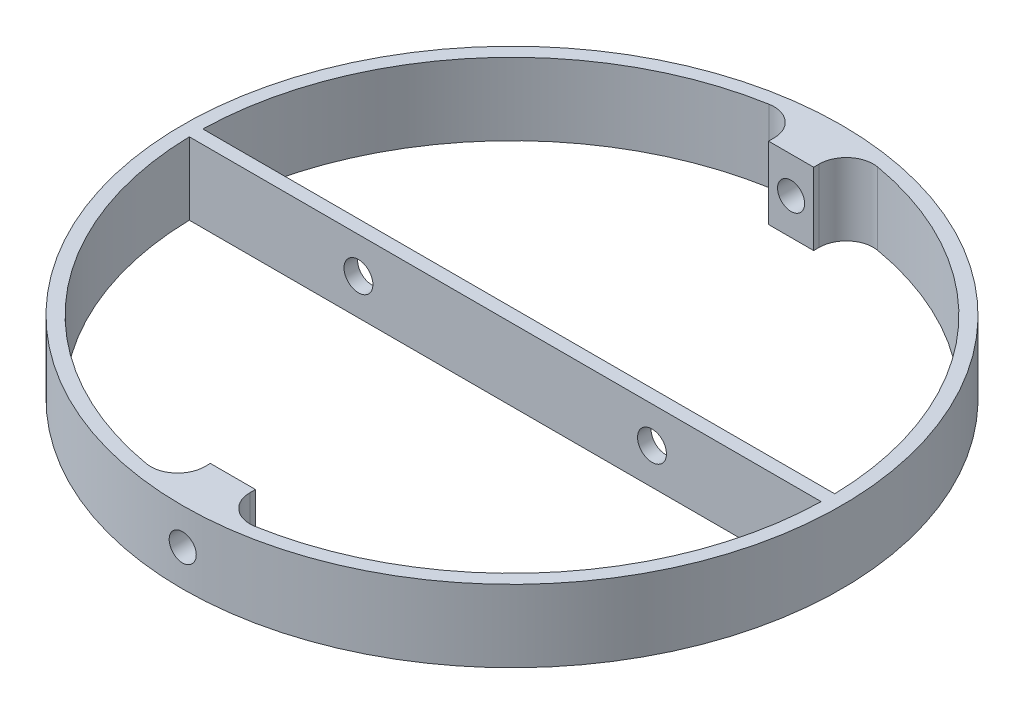
ISO-10303-21;
HEADER;
FILE_DESCRIPTION(('STEP AP214'),'2;1');
FILE_NAME('part.step','',(''),(''),'','','');
FILE_SCHEMA(('AUTOMOTIVE_DESIGN { 1 0 10303 214 1 1 1 1 }'));
ENDSEC;
DATA;
#1=APPLICATION_CONTEXT('core data for automotive mechanical design processes');
#2=APPLICATION_PROTOCOL_DEFINITION('international standard','automotive_design',2000,#1);
#3=PRODUCT_CONTEXT('',#1,'mechanical');
#4=PRODUCT('Part','Part','',(#3));
#5=PRODUCT_RELATED_PRODUCT_CATEGORY('part','',(#4));
#6=PRODUCT_DEFINITION_FORMATION('','',#4);
#7=PRODUCT_DEFINITION_CONTEXT('part definition',#1,'design');
#8=PRODUCT_DEFINITION('design','',#6,#7);
#9=PRODUCT_DEFINITION_SHAPE('','',#8);
#10=(LENGTH_UNIT() NAMED_UNIT(*) SI_UNIT(.MILLI.,.METRE.));
#11=(NAMED_UNIT(*) PLANE_ANGLE_UNIT() SI_UNIT($,.RADIAN.));
#12=(NAMED_UNIT(*) SI_UNIT($,.STERADIAN.) SOLID_ANGLE_UNIT());
#13=UNCERTAINTY_MEASURE_WITH_UNIT(LENGTH_MEASURE(1.E-05),#10,'distance_accuracy_value','');
#14=(GEOMETRIC_REPRESENTATION_CONTEXT(3) GLOBAL_UNCERTAINTY_ASSIGNED_CONTEXT((#13)) GLOBAL_UNIT_ASSIGNED_CONTEXT((#10,
#11,#12)) REPRESENTATION_CONTEXT('',''));
#15=CARTESIAN_POINT('',(0.,0.,0.));
#16=DIRECTION('',(0.,0.,1.));
#17=DIRECTION('',(1.,0.,0.));
#18=AXIS2_PLACEMENT_3D('',#15,#16,#17);
#19=CARTESIAN_POINT('',(0.,4.,0.));
#20=DIRECTION('',(0.,-1.,0.));
#21=DIRECTION('',(0.,0.,-1.));
#22=AXIS2_PLACEMENT_3D('',#19,#20,#21);
#23=CYLINDRICAL_SURFACE('',#22,36.5);
#24=CARTESIAN_POINT('',(0.,-4.,0.));
#25=DIRECTION('',(0.,1.,0.));
#26=DIRECTION('',(0.,0.,1.));
#27=AXIS2_PLACEMENT_3D('',#24,#25,#26);
#28=CIRCLE('',#27,36.5);
#29=CARTESIAN_POINT('',(0.,-4.,36.5));
#30=VERTEX_POINT('',#29);
#31=EDGE_CURVE('E174',#30,#30,#28,.T.);
#32=ORIENTED_EDGE('',*,*,#31,.T.);
#33=EDGE_LOOP('',(#32));
#34=FACE_BOUND('',#33,.T.);
#35=CARTESIAN_POINT('',(0.,4.,0.));
#36=DIRECTION('',(0.,1.,0.));
#37=DIRECTION('',(0.,0.,1.));
#38=AXIS2_PLACEMENT_3D('',#35,#36,#37);
#39=CIRCLE('',#38,36.5);
#40=CARTESIAN_POINT('',(0.,4.,36.5));
#41=VERTEX_POINT('',#40);
#42=EDGE_CURVE('E184',#41,#41,#39,.T.);
#43=ORIENTED_EDGE('',*,*,#42,.F.);
#44=EDGE_LOOP('',(#43));
#45=FACE_BOUND('',#44,.T.);
#46=CARTESIAN_POINT('',(1.5,0.,36.4691650576209));
#47=CARTESIAN_POINT('',(1.49999627712977,0.0842174806806867,36.4691654727784));
#48=CARTESIAN_POINT('',(1.49288360164586,0.168495121456788,36.4694599147074));
#49=CARTESIAN_POINT('',(1.46460989667378,0.334726733648258,36.4706061138936));
#50=CARTESIAN_POINT('',(1.44343219891228,0.416677827602146,36.4714585323841));
#51=CARTESIAN_POINT('',(1.38763469747089,0.575824179001918,36.4736239628223));
#52=CARTESIAN_POINT('',(1.35302160607741,0.653021788996812,36.4749367447421));
#53=CARTESIAN_POINT('',(1.27134582264112,0.800489682891105,36.4778746856881));
#54=CARTESIAN_POINT('',(1.22428612014412,0.8707616247076,36.479499769677));
#55=CARTESIAN_POINT('',(1.11901404288202,1.00245602102927,36.4828805666072));
#56=CARTESIAN_POINT('',(1.06079463482925,1.06387285169303,36.4846363614985));
#57=CARTESIAN_POINT('',(0.934869277519661,1.17606588607866,36.488079947785));
#58=CARTESIAN_POINT('',(0.867162946031318,1.22684166086279,36.4897677364367));
#59=CARTESIAN_POINT('',(0.724158987498465,1.31632457527012,36.4928856443443));
#60=CARTESIAN_POINT('',(0.648858820990925,1.35502765982304,36.4943156769552));
#61=CARTESIAN_POINT('',(0.492822636830936,1.41924043264145,36.4967561294673));
#62=CARTESIAN_POINT('',(0.412086650504941,1.44475019693228,36.4977665517865));
#63=CARTESIAN_POINT('',(0.247519393292795,1.4818382383119,36.499253386519));
#64=CARTESIAN_POINT('',(0.163689913435263,1.49342445017704,36.4997301030708));
#65=CARTESIAN_POINT('',(-0.00472539112217277,1.5023609694828,36.5000968164548));
#66=CARTESIAN_POINT('',(-0.089311211354027,1.49971136096556,36.4999868167507));
#67=CARTESIAN_POINT('',(-0.25678438616484,1.48025807510265,36.4991927528678));
#68=CARTESIAN_POINT('',(-0.339672735545438,1.46346294588897,36.4985090353872));
#69=CARTESIAN_POINT('',(-0.501452537562888,1.41620861089294,36.4966449700384));
#70=CARTESIAN_POINT('',(-0.580343977463555,1.3857493615728,36.4954646205878));
#71=CARTESIAN_POINT('',(-0.731918063482316,1.31202163252047,36.4927396890167));
#72=CARTESIAN_POINT('',(-0.804598807371535,1.26874924633724,36.4911949958449));
#73=CARTESIAN_POINT('',(-0.941667545936242,1.17062645726109,36.4879153976571));
#74=CARTESIAN_POINT('',(-1.00605550211961,1.11577600063007,36.4861804917582));
#75=CARTESIAN_POINT('',(-1.12476076523942,0.996005720707265,36.4827144022264));
#76=CARTESIAN_POINT('',(-1.17907059045482,0.931078481836806,36.4809832222943));
#77=CARTESIAN_POINT('',(-1.27602032028627,0.793023783110528,36.4777210468136));
#78=CARTESIAN_POINT('',(-1.31866022247567,0.719896321549557,36.4761900513066));
#79=CARTESIAN_POINT('',(-1.39105898510128,0.567512632935963,36.4735009817359));
#80=CARTESIAN_POINT('',(-1.4208175837822,0.488256281379437,36.4723429152505));
#81=CARTESIAN_POINT('',(-1.46660409784318,0.325866579422571,36.4705305957564));
#82=CARTESIAN_POINT('',(-1.48263208305901,0.242733248743341,36.4698763401853));
#83=CARTESIAN_POINT('',(-1.50049317862057,0.0750145709202017,36.4691458884583));
#84=CARTESIAN_POINT('',(-1.50233666386563,-0.00956966959801294,36.4690692698051));
#85=CARTESIAN_POINT('',(-1.49180348510873,-0.177846360399193,36.4695016291334));
#86=CARTESIAN_POINT('',(-1.4794268526285,-0.261538812658569,36.4700106058167));
#87=CARTESIAN_POINT('',(-1.44081336398823,-0.425627162955387,36.4715563987382));
#88=CARTESIAN_POINT('',(-1.4145812394599,-0.506024176286727,36.472593034777));
#89=CARTESIAN_POINT('',(-1.34900619156947,-0.661273776704302,36.4750771440585));
#90=CARTESIAN_POINT('',(-1.30966321735534,-0.736126342284351,36.4765246188946));
#91=CARTESIAN_POINT('',(-1.21895658567319,-0.878210021097048,36.4796682771395));
#92=CARTESIAN_POINT('',(-1.16758594944701,-0.945436675834785,36.4813646047247));
#93=CARTESIAN_POINT('',(-1.05429243826421,-1.07031539974948,36.4848142484667));
#94=CARTESIAN_POINT('',(-0.992369516427886,-1.12796742638784,36.4865675648766));
#95=CARTESIAN_POINT('',(-0.859684698074924,-1.23209511282749,36.4899347847021));
#96=CARTESIAN_POINT('',(-0.788917544915198,-1.27856407742287,36.4915486042335));
#97=CARTESIAN_POINT('',(-0.640579758797549,-1.35896079614293,36.4944537349901));
#98=CARTESIAN_POINT('',(-0.563009148239972,-1.39288859155742,36.4957450472772));
#99=CARTESIAN_POINT('',(-0.403291468674011,-1.44722815225677,36.4978592144783));
#100=CARTESIAN_POINT('',(-0.321145868149088,-1.46764422774339,36.4986822187695));
#101=CARTESIAN_POINT('',(-0.154589356719907,-1.49439493401989,36.4997676003611));
#102=CARTESIAN_POINT('',(-0.0701784531214033,-1.50072961021771,36.5000299794693));
#103=CARTESIAN_POINT('',(0.0984459266947519,-1.49913721244927,36.4999645476086));
#104=CARTESIAN_POINT('',(0.182659502632082,-1.49122065867127,36.4996371719935));
#105=CARTESIAN_POINT('',(0.348561042887096,-1.46137222420615,36.4984299581184));
#106=CARTESIAN_POINT('',(0.430249002308517,-1.43944031635007,36.4975501187874));
#107=CARTESIAN_POINT('',(0.58878327300713,-1.38218567266201,36.4953370225089));
#108=CARTESIAN_POINT('',(0.665629521162431,-1.34686276229225,36.4940037596516));
#109=CARTESIAN_POINT('',(0.812300607120264,-1.26383111787181,36.4910339024558));
#110=CARTESIAN_POINT('',(0.882125679764774,-1.21612279827556,36.489397318268));
#111=CARTESIAN_POINT('',(1.01282375571061,-1.10963872008058,36.4860037881951));
#112=CARTESIAN_POINT('',(1.07369108667315,-1.05085600205999,36.4842467670688));
#113=CARTESIAN_POINT('',(1.18471121576859,-0.923889308150094,36.4808107539502));
#114=CARTESIAN_POINT('',(1.23486136556362,-0.855703015363332,36.4791317813247));
#115=CARTESIAN_POINT('',(1.32303942260111,-0.711824836857678,36.4760403695905));
#116=CARTESIAN_POINT('',(1.36105759015399,-0.636126984363831,36.4746281449993));
#117=CARTESIAN_POINT('',(1.42380028872462,-0.479474477982601,36.4722331077676));
#118=CARTESIAN_POINT('',(1.44854059808691,-0.39852619213693,36.4712497857151));
#119=CARTESIAN_POINT('',(1.47750183703643,-0.264225554415599,36.4700850646762));
#120=CARTESIAN_POINT('',(1.48592795587244,-0.21174404656794,36.4697415720497));
#121=CARTESIAN_POINT('',(1.49717820949968,-0.106182998709553,36.4692814376972));
#122=CARTESIAN_POINT('',(1.50000234746142,-0.0531034590373052,36.4691647958428));
#123=CARTESIAN_POINT('',(1.5,0.,36.4691650576209));
#124=B_SPLINE_CURVE_WITH_KNOTS('',3,(#46,#47,#48,#49,#50,#51,#52,#53,#54,#55,#56,#57,#58,#59,
#60,#61,#62,#63,#64,#65,#66,#67,#68,#69,#70,#71,#72,#73,#74,#75,#76,#77,#78,#79,#80,#81,#82,#83,
#84,#85,#86,#87,#88,#89,#90,#91,#92,#93,#94,#95,#96,#97,#98,#99,#100,#101,#102,#103,#104,#105,
#106,#107,#108,#109,#110,#111,#112,#113,#114,#115,#116,#117,#118,#119,#120,#121,#122,#123),
.UNSPECIFIED.,.T.,.F.,(4,2,2,2,2,2,2,2,2,2,2,2,2,2,2,2,2,2,2,2,2,2,2,2,2,2,2,2,2,2,2,2,2,2,2,2,
2,2,4),(0.,0.25245860089904,0.505216922310907,0.757849128541452,1.01042071017696,
1.26315199891647,1.51589347321891,1.76871974913256,2.02154456814122,2.27422523850833,
2.52690441715964,2.77943101135911,3.03195841018608,3.28456287861991,3.53716851950998,
3.7899609440007,4.04275342105714,4.29555103475693,4.54834736268601,4.80095877144243,
5.05356962023648,5.30609425849095,5.55861987620404,5.81129238046393,6.0639660072786,
6.31679053343784,6.56961422720493,6.82235723198084,7.07509942174153,7.32765511495538,
7.58021129775345,7.83277077247165,8.08532179685137,8.33803206307437,8.59080470486408,
8.84377976776059,9.09645354595142,9.25564178633398,9.41482993662179),.UNSPECIFIED.);
#125=CARTESIAN_POINT('',(1.5,0.,36.4691650576209));
#126=VERTEX_POINT('',#125);
#127=EDGE_CURVE('E527',#126,#126,#124,.T.);
#128=ORIENTED_EDGE('',*,*,#127,.F.);
#129=EDGE_LOOP('',(#128));
#130=FACE_BOUND('',#129,.T.);
#131=CARTESIAN_POINT('',(-1.5,0.,-36.4691650576209));
#132=CARTESIAN_POINT('',(-1.49999627712977,-0.0842174806806867,-36.4691654727784));
#133=CARTESIAN_POINT('',(-1.49288360164586,-0.168495121456788,-36.4694599147074));
#134=CARTESIAN_POINT('',(-1.46460989667378,-0.334726733648258,-36.4706061138936));
#135=CARTESIAN_POINT('',(-1.44343219891228,-0.416677827602146,-36.4714585323841));
#136=CARTESIAN_POINT('',(-1.38763469747089,-0.575824179001918,-36.4736239628223));
#137=CARTESIAN_POINT('',(-1.35302160607741,-0.653021788996812,-36.4749367447421));
#138=CARTESIAN_POINT('',(-1.27134582264112,-0.800489682891105,-36.4778746856881));
#139=CARTESIAN_POINT('',(-1.22428612014412,-0.8707616247076,-36.479499769677));
#140=CARTESIAN_POINT('',(-1.11901404288202,-1.00245602102927,-36.4828805666072));
#141=CARTESIAN_POINT('',(-1.06079463482925,-1.06387285169303,-36.4846363614985));
#142=CARTESIAN_POINT('',(-0.934869277519661,-1.17606588607866,-36.488079947785));
#143=CARTESIAN_POINT('',(-0.867162946031318,-1.22684166086279,-36.4897677364367));
#144=CARTESIAN_POINT('',(-0.724158987498465,-1.31632457527012,-36.4928856443443));
#145=CARTESIAN_POINT('',(-0.648858820990925,-1.35502765982304,-36.4943156769552));
#146=CARTESIAN_POINT('',(-0.492822636830936,-1.41924043264145,-36.4967561294673));
#147=CARTESIAN_POINT('',(-0.412086650504941,-1.44475019693228,-36.4977665517865));
#148=CARTESIAN_POINT('',(-0.247519393292795,-1.4818382383119,-36.499253386519));
#149=CARTESIAN_POINT('',(-0.163689913435263,-1.49342445017704,-36.4997301030708));
#150=CARTESIAN_POINT('',(0.00472539112217277,-1.5023609694828,-36.5000968164548));
#151=CARTESIAN_POINT('',(0.089311211354027,-1.49971136096556,-36.4999868167507));
#152=CARTESIAN_POINT('',(0.25678438616484,-1.48025807510265,-36.4991927528678));
#153=CARTESIAN_POINT('',(0.339672735545438,-1.46346294588897,-36.4985090353872));
#154=CARTESIAN_POINT('',(0.501452537562888,-1.41620861089294,-36.4966449700384));
#155=CARTESIAN_POINT('',(0.580343977463555,-1.3857493615728,-36.4954646205878));
#156=CARTESIAN_POINT('',(0.731918063482316,-1.31202163252047,-36.4927396890167));
#157=CARTESIAN_POINT('',(0.804598807371535,-1.26874924633724,-36.4911949958449));
#158=CARTESIAN_POINT('',(0.941667545936242,-1.17062645726109,-36.4879153976571));
#159=CARTESIAN_POINT('',(1.00605550211961,-1.11577600063007,-36.4861804917582));
#160=CARTESIAN_POINT('',(1.12476076523942,-0.996005720707265,-36.4827144022264));
#161=CARTESIAN_POINT('',(1.17907059045482,-0.931078481836806,-36.4809832222943));
#162=CARTESIAN_POINT('',(1.27602032028627,-0.793023783110528,-36.4777210468136));
#163=CARTESIAN_POINT('',(1.31866022247567,-0.719896321549557,-36.4761900513066));
#164=CARTESIAN_POINT('',(1.39105898510128,-0.567512632935963,-36.4735009817359));
#165=CARTESIAN_POINT('',(1.4208175837822,-0.488256281379437,-36.4723429152505));
#166=CARTESIAN_POINT('',(1.46660409784318,-0.325866579422571,-36.4705305957564));
#167=CARTESIAN_POINT('',(1.48263208305901,-0.242733248743341,-36.4698763401853));
#168=CARTESIAN_POINT('',(1.50049317862057,-0.0750145709202017,-36.4691458884583));
#169=CARTESIAN_POINT('',(1.50233666386563,0.00956966959801294,-36.4690692698051));
#170=CARTESIAN_POINT('',(1.49180348510873,0.177846360399193,-36.4695016291334));
#171=CARTESIAN_POINT('',(1.4794268526285,0.261538812658569,-36.4700106058167));
#172=CARTESIAN_POINT('',(1.44081336398823,0.425627162955387,-36.4715563987382));
#173=CARTESIAN_POINT('',(1.4145812394599,0.506024176286727,-36.472593034777));
#174=CARTESIAN_POINT('',(1.34900619156947,0.661273776704302,-36.4750771440585));
#175=CARTESIAN_POINT('',(1.30966321735534,0.736126342284351,-36.4765246188946));
#176=CARTESIAN_POINT('',(1.21895658567319,0.878210021097048,-36.4796682771395));
#177=CARTESIAN_POINT('',(1.16758594944701,0.945436675834785,-36.4813646047247));
#178=CARTESIAN_POINT('',(1.05429243826421,1.07031539974948,-36.4848142484667));
#179=CARTESIAN_POINT('',(0.992369516427886,1.12796742638784,-36.4865675648766));
#180=CARTESIAN_POINT('',(0.859684698074924,1.23209511282749,-36.4899347847021));
#181=CARTESIAN_POINT('',(0.788917544915198,1.27856407742287,-36.4915486042335));
#182=CARTESIAN_POINT('',(0.640579758797549,1.35896079614293,-36.4944537349901));
#183=CARTESIAN_POINT('',(0.563009148239972,1.39288859155742,-36.4957450472772));
#184=CARTESIAN_POINT('',(0.403291468674011,1.44722815225677,-36.4978592144783));
#185=CARTESIAN_POINT('',(0.321145868149088,1.46764422774339,-36.4986822187695));
#186=CARTESIAN_POINT('',(0.154589356719907,1.49439493401989,-36.4997676003611));
#187=CARTESIAN_POINT('',(0.0701784531214033,1.50072961021771,-36.5000299794693));
#188=CARTESIAN_POINT('',(-0.0984459266947519,1.49913721244927,-36.4999645476086));
#189=CARTESIAN_POINT('',(-0.182659502632082,1.49122065867127,-36.4996371719935));
#190=CARTESIAN_POINT('',(-0.348561042887096,1.46137222420615,-36.4984299581184));
#191=CARTESIAN_POINT('',(-0.430249002308517,1.43944031635007,-36.4975501187874));
#192=CARTESIAN_POINT('',(-0.58878327300713,1.38218567266201,-36.4953370225089));
#193=CARTESIAN_POINT('',(-0.665629521162431,1.34686276229225,-36.4940037596516));
#194=CARTESIAN_POINT('',(-0.812300607120264,1.26383111787181,-36.4910339024558));
#195=CARTESIAN_POINT('',(-0.882125679764774,1.21612279827556,-36.489397318268));
#196=CARTESIAN_POINT('',(-1.01282375571061,1.10963872008058,-36.4860037881951));
#197=CARTESIAN_POINT('',(-1.07369108667315,1.05085600205999,-36.4842467670688));
#198=CARTESIAN_POINT('',(-1.18471121576859,0.923889308150094,-36.4808107539502));
#199=CARTESIAN_POINT('',(-1.23486136556362,0.855703015363332,-36.4791317813247));
#200=CARTESIAN_POINT('',(-1.32303942260111,0.711824836857678,-36.4760403695905));
#201=CARTESIAN_POINT('',(-1.36105759015399,0.636126984363831,-36.4746281449993));
#202=CARTESIAN_POINT('',(-1.42380028872462,0.479474477982601,-36.4722331077676));
#203=CARTESIAN_POINT('',(-1.44854059808691,0.39852619213693,-36.4712497857151));
#204=CARTESIAN_POINT('',(-1.47750183703643,0.264225554415599,-36.4700850646762));
#205=CARTESIAN_POINT('',(-1.48592795587244,0.21174404656794,-36.4697415720497));
#206=CARTESIAN_POINT('',(-1.49717820949968,0.106182998709553,-36.4692814376972));
#207=CARTESIAN_POINT('',(-1.50000234746142,0.0531034590373052,-36.4691647958428));
#208=CARTESIAN_POINT('',(-1.5,0.,-36.4691650576209));
#209=B_SPLINE_CURVE_WITH_KNOTS('',3,(#131,#132,#133,#134,#135,#136,#137,#138,#139,#140,#141,
#142,#143,#144,#145,#146,#147,#148,#149,#150,#151,#152,#153,#154,#155,#156,#157,#158,#159,#160,
#161,#162,#163,#164,#165,#166,#167,#168,#169,#170,#171,#172,#173,#174,#175,#176,#177,#178,#179,
#180,#181,#182,#183,#184,#185,#186,#187,#188,#189,#190,#191,#192,#193,#194,#195,#196,#197,#198,
#199,#200,#201,#202,#203,#204,#205,#206,#207,#208),.UNSPECIFIED.,.T.,.F.,(4,2,2,2,2,2,2,2,2,2,2,
2,2,2,2,2,2,2,2,2,2,2,2,2,2,2,2,2,2,2,2,2,2,2,2,2,2,2,4),(0.,0.25245860089904,0.505216922310907,
0.757849128541452,1.01042071017696,1.26315199891647,1.51589347321891,1.76871974913256,
2.02154456814122,2.27422523850833,2.52690441715964,2.77943101135911,3.03195841018608,
3.28456287861991,3.53716851950998,3.7899609440007,4.04275342105714,4.29555103475693,
4.54834736268601,4.80095877144243,5.05356962023648,5.30609425849095,5.55861987620404,
5.81129238046393,6.0639660072786,6.31679053343784,6.56961422720493,6.82235723198084,
7.07509942174153,7.32765511495538,7.58021129775345,7.83277077247165,8.08532179685137,
8.33803206307437,8.59080470486408,8.84377976776059,9.09645354595142,9.25564178633398,
9.41482993662179),.UNSPECIFIED.);
#210=CARTESIAN_POINT('',(-1.5,0.,-36.4691650576209));
#211=VERTEX_POINT('',#210);
#212=EDGE_CURVE('E537',#211,#211,#209,.T.);
#213=ORIENTED_EDGE('',*,*,#212,.T.);
#214=EDGE_LOOP('',(#213));
#215=FACE_BOUND('',#214,.T.);
#216=ADVANCED_FACE('F35',(#34,#45,#130,#215),#23,.T.);
#217=CARTESIAN_POINT('',(0.,4.,-0.75));
#218=DIRECTION('',(0.,0.,-1.));
#219=DIRECTION('',(-1.,0.,0.));
#220=AXIS2_PLACEMENT_3D('',#217,#218,#219);
#221=PLANE('',#220);
#222=CARTESIAN_POINT('',(16.256,0.,-0.750000000000001));
#223=DIRECTION('',(0.,0.,-1.));
#224=DIRECTION('',(-1.,0.,0.));
#225=AXIS2_PLACEMENT_3D('',#222,#223,#224);
#226=CIRCLE('',#225,1.6);
#227=CARTESIAN_POINT('',(14.656,0.,-0.750000000000001));
#228=VERTEX_POINT('',#227);
#229=EDGE_CURVE('E554',#228,#228,#226,.F.);
#230=ORIENTED_EDGE('',*,*,#229,.T.);
#231=EDGE_LOOP('',(#230));
#232=FACE_BOUND('',#231,.T.);
#233=CARTESIAN_POINT('',(-16.256,0.,-0.750000000000001));
#234=DIRECTION('',(0.,0.,-1.));
#235=DIRECTION('',(-1.,0.,0.));
#236=AXIS2_PLACEMENT_3D('',#233,#234,#235);
#237=CIRCLE('',#236,1.6);
#238=CARTESIAN_POINT('',(-17.856,0.,-0.750000000000001));
#239=VERTEX_POINT('',#238);
#240=EDGE_CURVE('E548',#239,#239,#237,.F.);
#241=ORIENTED_EDGE('',*,*,#240,.T.);
#242=EDGE_LOOP('',(#241));
#243=FACE_BOUND('',#242,.T.);
#244=DIRECTION('',(1.,0.,0.));
#245=VECTOR('',#244,1.);
#246=CARTESIAN_POINT('',(0.,-4.,-0.75));
#247=LINE('',#246,#245);
#248=CARTESIAN_POINT('',(-34.9919633630352,-4.,-0.75));
#249=VERTEX_POINT('',#248);
#250=CARTESIAN_POINT('',(34.9919633630352,-4.,-0.75));
#251=VERTEX_POINT('',#250);
#252=EDGE_CURVE('E226',#249,#251,#247,.T.);
#253=ORIENTED_EDGE('',*,*,#252,.F.);
#254=DIRECTION('',(0.,-1.,0.));
#255=VECTOR('',#254,1.);
#256=CARTESIAN_POINT('',(-34.9919633630352,4.,-0.75));
#257=LINE('',#256,#255);
#258=CARTESIAN_POINT('',(-34.9919633630352,4.,-0.75));
#259=VERTEX_POINT('',#258);
#260=EDGE_CURVE('E244',#259,#249,#257,.T.);
#261=ORIENTED_EDGE('',*,*,#260,.F.);
#262=DIRECTION('',(1.,0.,0.));
#263=VECTOR('',#262,1.);
#264=CARTESIAN_POINT('',(0.,4.,-0.75));
#265=LINE('',#264,#263);
#266=CARTESIAN_POINT('',(34.9919633630352,4.,-0.75));
#267=VERTEX_POINT('',#266);
#268=EDGE_CURVE('E196',#259,#267,#265,.T.);
#269=ORIENTED_EDGE('',*,*,#268,.T.);
#270=DIRECTION('',(0.,-1.,0.));
#271=VECTOR('',#270,1.);
#272=CARTESIAN_POINT('',(34.9919633630352,4.,-0.75));
#273=LINE('',#272,#271);
#274=EDGE_CURVE('E158',#267,#251,#273,.T.);
#275=ORIENTED_EDGE('',*,*,#274,.T.);
#276=EDGE_LOOP('',(#253,#261,#269,#275));
#277=FACE_BOUND('',#276,.T.);
#278=ADVANCED_FACE('F301',(#232,#243,#277),#221,.T.);
#279=CARTESIAN_POINT('',(0.,4.,0.));
#280=DIRECTION('',(0.,-1.,0.));
#281=DIRECTION('',(0.,0.,-1.));
#282=AXIS2_PLACEMENT_3D('',#279,#280,#281);
#283=CYLINDRICAL_SURFACE('',#282,35.);
#284=CARTESIAN_POINT('',(0.,-4.,0.));
#285=DIRECTION('',(0.,1.,0.));
#286=DIRECTION('',(0.,0.,1.));
#287=AXIS2_PLACEMENT_3D('',#284,#285,#286);
#288=CIRCLE('',#287,35.);
#289=CARTESIAN_POINT('',(-6.015625,-4.,-34.479156832199));
#290=VERTEX_POINT('',#289);
#291=EDGE_CURVE('E229',#290,#249,#288,.T.);
#292=ORIENTED_EDGE('',*,*,#291,.F.);
#293=DIRECTION('',(0.,-1.,0.));
#294=VECTOR('',#293,1.);
#295=CARTESIAN_POINT('',(-6.015625,4.,-34.479156832199));
#296=LINE('',#295,#294);
#297=CARTESIAN_POINT('',(-6.015625,4.,-34.479156832199));
#298=VERTEX_POINT('',#297);
#299=EDGE_CURVE('E259',#290,#298,#296,.F.);
#300=ORIENTED_EDGE('',*,*,#299,.T.);
#301=CARTESIAN_POINT('',(0.,4.,0.));
#302=DIRECTION('',(0.,1.,0.));
#303=DIRECTION('',(0.,0.,1.));
#304=AXIS2_PLACEMENT_3D('',#301,#302,#303);
#305=CIRCLE('',#304,35.);
#306=EDGE_CURVE('E182',#298,#259,#305,.T.);
#307=ORIENTED_EDGE('',*,*,#306,.T.);
#308=ORIENTED_EDGE('',*,*,#260,.T.);
#309=EDGE_LOOP('',(#292,#300,#307,#308));
#310=FACE_BOUND('',#309,.T.);
#311=ADVANCED_FACE('F307',(#310),#283,.F.);
#312=CARTESIAN_POINT('',(-2.50000000000001,4.,0.));
#313=DIRECTION('',(-1.,0.,0.));
#314=DIRECTION('',(0.,0.,1.));
#315=AXIS2_PLACEMENT_3D('',#312,#313,#314);
#316=PLANE('',#315);
#317=DIRECTION('',(0.,0.,-1.));
#318=VECTOR('',#317,1.);
#319=CARTESIAN_POINT('',(-2.50000000000001,4.,0.));
#320=LINE('',#319,#318);
#321=CARTESIAN_POINT('',(-2.5,4.,-30.9106001094224));
#322=VERTEX_POINT('',#321);
#323=CARTESIAN_POINT('',(-2.5,4.,-31.5238005322962));
#324=VERTEX_POINT('',#323);
#325=EDGE_CURVE('E195',#322,#324,#320,.T.);
#326=ORIENTED_EDGE('',*,*,#325,.T.);
#327=DIRECTION('',(0.,1.,0.));
#328=VECTOR('',#327,1.);
#329=CARTESIAN_POINT('',(-2.5,-4.,-31.5238005322962));
#330=LINE('',#329,#328);
#331=CARTESIAN_POINT('',(-2.5,-4.,-31.5238005322962));
#332=VERTEX_POINT('',#331);
#333=EDGE_CURVE('E256',#324,#332,#330,.F.);
#334=ORIENTED_EDGE('',*,*,#333,.T.);
#335=DIRECTION('',(0.,0.,-1.));
#336=VECTOR('',#335,1.);
#337=CARTESIAN_POINT('',(-2.50000000000001,-4.,0.));
#338=LINE('',#337,#336);
#339=CARTESIAN_POINT('',(-2.5,-4.,-30.9106001094224));
#340=VERTEX_POINT('',#339);
#341=EDGE_CURVE('E230',#340,#332,#338,.T.);
#342=ORIENTED_EDGE('',*,*,#341,.F.);
#343=DIRECTION('',(0.,-1.,0.));
#344=VECTOR('',#343,1.);
#345=CARTESIAN_POINT('',(-2.5,4.,-30.9106001094224));
#346=LINE('',#345,#344);
#347=EDGE_CURVE('E242',#322,#340,#346,.T.);
#348=ORIENTED_EDGE('',*,*,#347,.F.);
#349=EDGE_LOOP('',(#326,#334,#342,#348));
#350=FACE_BOUND('',#349,.T.);
#351=ADVANCED_FACE('F325',(#350),#316,.T.);
#352=CARTESIAN_POINT('',(0.,4.,-30.9106001094224));
#353=DIRECTION('',(0.,0.,1.));
#354=DIRECTION('',(1.,0.,0.));
#355=AXIS2_PLACEMENT_3D('',#352,#353,#354);
#356=PLANE('',#355);
#357=CARTESIAN_POINT('',(0.,0.,-30.9106001094224));
#358=DIRECTION('',(0.,0.,1.));
#359=DIRECTION('',(1.,0.,0.));
#360=AXIS2_PLACEMENT_3D('',#357,#358,#359);
#361=CIRCLE('',#360,1.5);
#362=CARTESIAN_POINT('',(1.5,0.,-30.9106001094224));
#363=VERTEX_POINT('',#362);
#364=EDGE_CURVE('E532',#363,#363,#361,.T.);
#365=ORIENTED_EDGE('',*,*,#364,.F.);
#366=EDGE_LOOP('',(#365));
#367=FACE_BOUND('',#366,.T.);
#368=DIRECTION('',(-1.,0.,0.));
#369=VECTOR('',#368,1.);
#370=CARTESIAN_POINT('',(0.,-4.,-30.9106001094224));
#371=LINE('',#370,#369);
#372=CARTESIAN_POINT('',(2.5,-4.,-30.9106001094224));
#373=VERTEX_POINT('',#372);
#374=EDGE_CURVE('E233',#373,#340,#371,.T.);
#375=ORIENTED_EDGE('',*,*,#374,.F.);
#376=DIRECTION('',(0.,-1.,0.));
#377=VECTOR('',#376,1.);
#378=CARTESIAN_POINT('',(2.5,4.,-30.9106001094224));
#379=LINE('',#378,#377);
#380=CARTESIAN_POINT('',(2.5,4.,-30.9106001094224));
#381=VERTEX_POINT('',#380);
#382=EDGE_CURVE('E239',#381,#373,#379,.T.);
#383=ORIENTED_EDGE('',*,*,#382,.F.);
#384=DIRECTION('',(-1.,0.,0.));
#385=VECTOR('',#384,1.);
#386=CARTESIAN_POINT('',(0.,4.,-30.9106001094224));
#387=LINE('',#386,#385);
#388=EDGE_CURVE('E193',#381,#322,#387,.T.);
#389=ORIENTED_EDGE('',*,*,#388,.T.);
#390=ORIENTED_EDGE('',*,*,#347,.T.);
#391=EDGE_LOOP('',(#375,#383,#389,#390));
#392=FACE_BOUND('',#391,.T.);
#393=ADVANCED_FACE('F321',(#367,#392),#356,.T.);
#394=CARTESIAN_POINT('',(2.5,4.,0.));
#395=DIRECTION('',(1.,0.,0.));
#396=DIRECTION('',(0.,0.,-1.));
#397=AXIS2_PLACEMENT_3D('',#394,#395,#396);
#398=PLANE('',#397);
#399=DIRECTION('',(0.,0.,1.));
#400=VECTOR('',#399,1.);
#401=CARTESIAN_POINT('',(2.5,-4.,0.));
#402=LINE('',#401,#400);
#403=CARTESIAN_POINT('',(2.5,-4.,-31.5238005322962));
#404=VERTEX_POINT('',#403);
#405=EDGE_CURVE('E236',#404,#373,#402,.T.);
#406=ORIENTED_EDGE('',*,*,#405,.F.);
#407=DIRECTION('',(0.,1.,0.));
#408=VECTOR('',#407,1.);
#409=CARTESIAN_POINT('',(2.5,4.,-31.5238005322962));
#410=LINE('',#409,#408);
#411=CARTESIAN_POINT('',(2.5,4.,-31.5238005322962));
#412=VERTEX_POINT('',#411);
#413=EDGE_CURVE('E254',#404,#412,#410,.T.);
#414=ORIENTED_EDGE('',*,*,#413,.T.);
#415=DIRECTION('',(0.,0.,1.));
#416=VECTOR('',#415,1.);
#417=CARTESIAN_POINT('',(2.5,4.,0.));
#418=LINE('',#417,#416);
#419=EDGE_CURVE('E185',#412,#381,#418,.T.);
#420=ORIENTED_EDGE('',*,*,#419,.T.);
#421=ORIENTED_EDGE('',*,*,#382,.T.);
#422=EDGE_LOOP('',(#406,#414,#420,#421));
#423=FACE_BOUND('',#422,.T.);
#424=ADVANCED_FACE('F318',(#423),#398,.T.);
#425=CARTESIAN_POINT('',(-34.9919633630352,4.,0.75));
#426=VERTEX_POINT('',#425);
#427=CARTESIAN_POINT('',(-6.015625,4.,34.479156832199));
#428=VERTEX_POINT('',#427);
#429=EDGE_CURVE('E151',#426,#428,#305,.T.);
#430=ORIENTED_EDGE('',*,*,#429,.T.);
#431=DIRECTION('',(0.,-1.,0.));
#432=VECTOR('',#431,1.);
#433=CARTESIAN_POINT('',(-6.015625,4.,34.479156832199));
#434=LINE('',#433,#432);
#435=CARTESIAN_POINT('',(-6.015625,-4.,34.479156832199));
#436=VERTEX_POINT('',#435);
#437=EDGE_CURVE('E261',#428,#436,#434,.T.);
#438=ORIENTED_EDGE('',*,*,#437,.T.);
#439=CARTESIAN_POINT('',(-34.9919633630352,-4.,0.75));
#440=VERTEX_POINT('',#439);
#441=EDGE_CURVE('E154',#440,#436,#288,.T.);
#442=ORIENTED_EDGE('',*,*,#441,.F.);
#443=DIRECTION('',(0.,-1.,0.));
#444=VECTOR('',#443,1.);
#445=CARTESIAN_POINT('',(-34.9919633630352,4.,0.75));
#446=LINE('',#445,#444);
#447=EDGE_CURVE('E146',#426,#440,#446,.T.);
#448=ORIENTED_EDGE('',*,*,#447,.F.);
#449=EDGE_LOOP('',(#430,#438,#442,#448));
#450=FACE_BOUND('',#449,.T.);
#451=ADVANCED_FACE('F148',(#450),#283,.F.);
#452=CARTESIAN_POINT('',(0.,4.,0.75));
#453=DIRECTION('',(0.,0.,-1.));
#454=DIRECTION('',(-1.,0.,0.));
#455=AXIS2_PLACEMENT_3D('',#452,#453,#454);
#456=PLANE('',#455);
#457=CARTESIAN_POINT('',(16.256,0.,0.75));
#458=DIRECTION('',(0.,0.,1.));
#459=DIRECTION('',(1.,0.,0.));
#460=AXIS2_PLACEMENT_3D('',#457,#458,#459);
#461=CIRCLE('',#460,1.6);
#462=CARTESIAN_POINT('',(17.856,0.,0.75));
#463=VERTEX_POINT('',#462);
#464=EDGE_CURVE('E551',#463,#463,#461,.T.);
#465=ORIENTED_EDGE('',*,*,#464,.F.);
#466=EDGE_LOOP('',(#465));
#467=FACE_BOUND('',#466,.T.);
#468=CARTESIAN_POINT('',(-16.256,0.,0.75));
#469=DIRECTION('',(0.,0.,1.));
#470=DIRECTION('',(1.,0.,0.));
#471=AXIS2_PLACEMENT_3D('',#468,#469,#470);
#472=CIRCLE('',#471,1.6);
#473=CARTESIAN_POINT('',(-14.656,0.,0.75));
#474=VERTEX_POINT('',#473);
#475=EDGE_CURVE('E543',#474,#474,#472,.T.);
#476=ORIENTED_EDGE('',*,*,#475,.F.);
#477=EDGE_LOOP('',(#476));
#478=FACE_BOUND('',#477,.T.);
#479=DIRECTION('',(1.,0.,0.));
#480=VECTOR('',#479,1.);
#481=CARTESIAN_POINT('',(0.,-4.,0.75));
#482=LINE('',#481,#480);
#483=CARTESIAN_POINT('',(34.9919633630352,-4.,0.75));
#484=VERTEX_POINT('',#483);
#485=EDGE_CURVE('E215',#440,#484,#482,.T.);
#486=ORIENTED_EDGE('',*,*,#485,.T.);
#487=DIRECTION('',(0.,-1.,0.));
#488=VECTOR('',#487,1.);
#489=CARTESIAN_POINT('',(34.9919633630352,4.,0.75));
#490=LINE('',#489,#488);
#491=CARTESIAN_POINT('',(34.9919633630352,4.,0.75));
#492=VERTEX_POINT('',#491);
#493=EDGE_CURVE('E159',#492,#484,#490,.T.);
#494=ORIENTED_EDGE('',*,*,#493,.F.);
#495=DIRECTION('',(1.,0.,0.));
#496=VECTOR('',#495,1.);
#497=CARTESIAN_POINT('',(0.,4.,0.75));
#498=LINE('',#497,#496);
#499=EDGE_CURVE('E163',#426,#492,#498,.T.);
#500=ORIENTED_EDGE('',*,*,#499,.F.);
#501=ORIENTED_EDGE('',*,*,#447,.T.);
#502=EDGE_LOOP('',(#486,#494,#500,#501));
#503=FACE_BOUND('',#502,.T.);
#504=ADVANCED_FACE('F164',(#467,#478,#503),#456,.F.);
#505=CARTESIAN_POINT('',(6.015625,-4.,34.479156832199));
#506=VERTEX_POINT('',#505);
#507=EDGE_CURVE('E217',#506,#484,#288,.T.);
#508=ORIENTED_EDGE('',*,*,#507,.F.);
#509=DIRECTION('',(0.,-1.,0.));
#510=VECTOR('',#509,1.);
#511=CARTESIAN_POINT('',(6.015625,4.,34.479156832199));
#512=LINE('',#511,#510);
#513=CARTESIAN_POINT('',(6.015625,4.,34.479156832199));
#514=VERTEX_POINT('',#513);
#515=EDGE_CURVE('E50',#506,#514,#512,.F.);
#516=ORIENTED_EDGE('',*,*,#515,.T.);
#517=EDGE_CURVE('E167',#514,#492,#305,.T.);
#518=ORIENTED_EDGE('',*,*,#517,.T.);
#519=ORIENTED_EDGE('',*,*,#493,.T.);
#520=EDGE_LOOP('',(#508,#516,#518,#519));
#521=FACE_BOUND('',#520,.T.);
#522=ADVANCED_FACE('F338',(#521),#283,.F.);
#523=CARTESIAN_POINT('',(2.5,4.,0.));
#524=DIRECTION('',(-1.,0.,0.));
#525=DIRECTION('',(0.,0.,1.));
#526=AXIS2_PLACEMENT_3D('',#523,#524,#525);
#527=PLANE('',#526);
#528=DIRECTION('',(0.,0.,-1.));
#529=VECTOR('',#528,1.);
#530=CARTESIAN_POINT('',(2.5,4.,0.));
#531=LINE('',#530,#529);
#532=CARTESIAN_POINT('',(2.5,4.,31.5238005322962));
#533=VERTEX_POINT('',#532);
#534=CARTESIAN_POINT('',(2.5,4.,30.9106001094224));
#535=VERTEX_POINT('',#534);
#536=EDGE_CURVE('E181',#533,#535,#531,.T.);
#537=ORIENTED_EDGE('',*,*,#536,.F.);
#538=DIRECTION('',(0.,-1.,0.));
#539=VECTOR('',#538,1.);
#540=CARTESIAN_POINT('',(2.5,4.,31.5238005322962));
#541=LINE('',#540,#539);
#542=CARTESIAN_POINT('',(2.5,-4.,31.5238005322962));
#543=VERTEX_POINT('',#542);
#544=EDGE_CURVE('E265',#533,#543,#541,.T.);
#545=ORIENTED_EDGE('',*,*,#544,.T.);
#546=DIRECTION('',(0.,0.,-1.));
#547=VECTOR('',#546,1.);
#548=CARTESIAN_POINT('',(2.5,-4.,0.));
#549=LINE('',#548,#547);
#550=CARTESIAN_POINT('',(2.5,-4.,30.9106001094224));
#551=VERTEX_POINT('',#550);
#552=EDGE_CURVE('E219',#543,#551,#549,.T.);
#553=ORIENTED_EDGE('',*,*,#552,.T.);
#554=DIRECTION('',(0.,-1.,0.));
#555=VECTOR('',#554,1.);
#556=CARTESIAN_POINT('',(2.5,4.,30.9106001094224));
#557=LINE('',#556,#555);
#558=EDGE_CURVE('E249',#535,#551,#557,.T.);
#559=ORIENTED_EDGE('',*,*,#558,.F.);
#560=EDGE_LOOP('',(#537,#545,#553,#559));
#561=FACE_BOUND('',#560,.T.);
#562=ADVANCED_FACE('F334',(#561),#527,.F.);
#563=CARTESIAN_POINT('',(0.,4.,30.9106001094224));
#564=DIRECTION('',(0.,0.,1.));
#565=DIRECTION('',(1.,0.,0.));
#566=AXIS2_PLACEMENT_3D('',#563,#564,#565);
#567=PLANE('',#566);
#568=CARTESIAN_POINT('',(0.,0.,30.9106001094224));
#569=DIRECTION('',(0.,0.,1.));
#570=DIRECTION('',(1.,0.,0.));
#571=AXIS2_PLACEMENT_3D('',#568,#569,#570);
#572=CIRCLE('',#571,1.5);
#573=CARTESIAN_POINT('',(1.5,0.,30.9106001094224));
#574=VERTEX_POINT('',#573);
#575=EDGE_CURVE('E216',#574,#574,#572,.F.);
#576=ORIENTED_EDGE('',*,*,#575,.F.);
#577=EDGE_LOOP('',(#576));
#578=FACE_BOUND('',#577,.T.);
#579=DIRECTION('',(-1.,0.,0.));
#580=VECTOR('',#579,1.);
#581=CARTESIAN_POINT('',(0.,-4.,30.9106001094224));
#582=LINE('',#581,#580);
#583=CARTESIAN_POINT('',(-2.5,-4.,30.9106001094224));
#584=VERTEX_POINT('',#583);
#585=EDGE_CURVE('E221',#551,#584,#582,.T.);
#586=ORIENTED_EDGE('',*,*,#585,.T.);
#587=DIRECTION('',(0.,-1.,0.));
#588=VECTOR('',#587,1.);
#589=CARTESIAN_POINT('',(-2.5,4.,30.9106001094224));
#590=LINE('',#589,#588);
#591=CARTESIAN_POINT('',(-2.5,4.,30.9106001094224));
#592=VERTEX_POINT('',#591);
#593=EDGE_CURVE('E191',#592,#584,#590,.T.);
#594=ORIENTED_EDGE('',*,*,#593,.F.);
#595=DIRECTION('',(-1.,0.,0.));
#596=VECTOR('',#595,1.);
#597=CARTESIAN_POINT('',(0.,4.,30.9106001094224));
#598=LINE('',#597,#596);
#599=EDGE_CURVE('E208',#535,#592,#598,.T.);
#600=ORIENTED_EDGE('',*,*,#599,.F.);
#601=ORIENTED_EDGE('',*,*,#558,.T.);
#602=EDGE_LOOP('',(#586,#594,#600,#601));
#603=FACE_BOUND('',#602,.T.);
#604=ADVANCED_FACE('F317',(#578,#603),#567,.F.);
#605=CARTESIAN_POINT('',(6.015625,4.,-34.479156832199));
#606=VERTEX_POINT('',#605);
#607=EDGE_CURVE('E176',#267,#606,#305,.T.);
#608=ORIENTED_EDGE('',*,*,#607,.T.);
#609=DIRECTION('',(0.,-1.,0.));
#610=VECTOR('',#609,1.);
#611=CARTESIAN_POINT('',(6.015625,4.,-34.479156832199));
#612=LINE('',#611,#610);
#613=CARTESIAN_POINT('',(6.015625,-4.,-34.479156832199));
#614=VERTEX_POINT('',#613);
#615=EDGE_CURVE('E246',#606,#614,#612,.T.);
#616=ORIENTED_EDGE('',*,*,#615,.T.);
#617=EDGE_CURVE('E178',#251,#614,#288,.T.);
#618=ORIENTED_EDGE('',*,*,#617,.F.);
#619=ORIENTED_EDGE('',*,*,#274,.F.);
#620=EDGE_LOOP('',(#608,#616,#618,#619));
#621=FACE_BOUND('',#620,.T.);
#622=ADVANCED_FACE('F314',(#621),#283,.F.);
#623=CARTESIAN_POINT('',(-2.5,4.,0.));
#624=DIRECTION('',(1.,0.,0.));
#625=DIRECTION('',(0.,0.,-1.));
#626=AXIS2_PLACEMENT_3D('',#623,#624,#625);
#627=PLANE('',#626);
#628=DIRECTION('',(0.,0.,1.));
#629=VECTOR('',#628,1.);
#630=CARTESIAN_POINT('',(-2.5,-4.,0.));
#631=LINE('',#630,#629);
#632=CARTESIAN_POINT('',(-2.5,-4.,31.5238005322962));
#633=VERTEX_POINT('',#632);
#634=EDGE_CURVE('E223',#584,#633,#631,.T.);
#635=ORIENTED_EDGE('',*,*,#634,.T.);
#636=DIRECTION('',(0.,-1.,0.));
#637=VECTOR('',#636,1.);
#638=CARTESIAN_POINT('',(-2.5,4.,31.5238005322962));
#639=LINE('',#638,#637);
#640=CARTESIAN_POINT('',(-2.5,4.,31.5238005322962));
#641=VERTEX_POINT('',#640);
#642=EDGE_CURVE('E263',#633,#641,#639,.F.);
#643=ORIENTED_EDGE('',*,*,#642,.T.);
#644=DIRECTION('',(0.,0.,1.));
#645=VECTOR('',#644,1.);
#646=CARTESIAN_POINT('',(-2.5,4.,0.));
#647=LINE('',#646,#645);
#648=EDGE_CURVE('E204',#592,#641,#647,.T.);
#649=ORIENTED_EDGE('',*,*,#648,.F.);
#650=ORIENTED_EDGE('',*,*,#593,.T.);
#651=EDGE_LOOP('',(#635,#643,#649,#650));
#652=FACE_BOUND('',#651,.T.);
#653=ADVANCED_FACE('F286',(#652),#627,.F.);
#654=CARTESIAN_POINT('',(0.,4.,0.));
#655=DIRECTION('',(0.,1.,0.));
#656=DIRECTION('',(0.,0.,1.));
#657=AXIS2_PLACEMENT_3D('',#654,#655,#656);
#658=PLANE('',#657);
#659=ORIENTED_EDGE('',*,*,#429,.F.);
#660=ORIENTED_EDGE('',*,*,#499,.T.);
#661=ORIENTED_EDGE('',*,*,#517,.F.);
#662=CARTESIAN_POINT('',(5.5,4.,31.5238005322962));
#663=DIRECTION('',(0.,1.,0.));
#664=DIRECTION('',(0.,0.,1.));
#665=AXIS2_PLACEMENT_3D('',#662,#663,#664);
#666=CIRCLE('',#665,3.);
#667=EDGE_CURVE('E11',#514,#533,#666,.F.);
#668=ORIENTED_EDGE('',*,*,#667,.T.);
#669=ORIENTED_EDGE('',*,*,#536,.T.);
#670=ORIENTED_EDGE('',*,*,#599,.T.);
#671=ORIENTED_EDGE('',*,*,#648,.T.);
#672=CARTESIAN_POINT('',(-5.5,4.,31.5238005322962));
#673=DIRECTION('',(0.,1.,0.));
#674=DIRECTION('',(0.,0.,1.));
#675=AXIS2_PLACEMENT_3D('',#672,#673,#674);
#676=CIRCLE('',#675,3.);
#677=EDGE_CURVE('E173',#641,#428,#676,.F.);
#678=ORIENTED_EDGE('',*,*,#677,.T.);
#679=EDGE_LOOP('',(#659,#660,#661,#668,#669,#670,#671,#678));
#680=FACE_BOUND('',#679,.T.);
#681=ORIENTED_EDGE('',*,*,#268,.F.);
#682=ORIENTED_EDGE('',*,*,#306,.F.);
#683=CARTESIAN_POINT('',(-5.5,4.,-31.5238005322962));
#684=DIRECTION('',(0.,1.,0.));
#685=DIRECTION('',(0.,0.,1.));
#686=AXIS2_PLACEMENT_3D('',#683,#684,#685);
#687=CIRCLE('',#686,3.);
#688=EDGE_CURVE('E275',#298,#324,#687,.F.);
#689=ORIENTED_EDGE('',*,*,#688,.T.);
#690=ORIENTED_EDGE('',*,*,#325,.F.);
#691=ORIENTED_EDGE('',*,*,#388,.F.);
#692=ORIENTED_EDGE('',*,*,#419,.F.);
#693=CARTESIAN_POINT('',(5.5,4.,-31.5238005322962));
#694=DIRECTION('',(0.,1.,0.));
#695=DIRECTION('',(0.,0.,1.));
#696=AXIS2_PLACEMENT_3D('',#693,#694,#695);
#697=CIRCLE('',#696,3.);
#698=EDGE_CURVE('E271',#412,#606,#697,.F.);
#699=ORIENTED_EDGE('',*,*,#698,.T.);
#700=ORIENTED_EDGE('',*,*,#607,.F.);
#701=EDGE_LOOP('',(#681,#682,#689,#690,#691,#692,#699,#700));
#702=FACE_BOUND('',#701,.T.);
#703=ORIENTED_EDGE('',*,*,#42,.T.);
#704=EDGE_LOOP('',(#703));
#705=FACE_BOUND('',#704,.T.);
#706=ADVANCED_FACE('F169',(#680,#702,#705),#658,.T.);
#707=CARTESIAN_POINT('',(0.,-4.,0.));
#708=DIRECTION('',(0.,1.,0.));
#709=DIRECTION('',(0.,0.,1.));
#710=AXIS2_PLACEMENT_3D('',#707,#708,#709);
#711=PLANE('',#710);
#712=ORIENTED_EDGE('',*,*,#441,.T.);
#713=CARTESIAN_POINT('',(-5.5,-4.,31.5238005322962));
#714=DIRECTION('',(0.,1.,0.));
#715=DIRECTION('',(0.,0.,1.));
#716=AXIS2_PLACEMENT_3D('',#713,#714,#715);
#717=CIRCLE('',#716,3.);
#718=EDGE_CURVE('E277',#436,#633,#717,.T.);
#719=ORIENTED_EDGE('',*,*,#718,.T.);
#720=ORIENTED_EDGE('',*,*,#634,.F.);
#721=ORIENTED_EDGE('',*,*,#585,.F.);
#722=ORIENTED_EDGE('',*,*,#552,.F.);
#723=CARTESIAN_POINT('',(5.5,-4.,31.5238005322962));
#724=DIRECTION('',(0.,1.,0.));
#725=DIRECTION('',(0.,0.,1.));
#726=AXIS2_PLACEMENT_3D('',#723,#724,#725);
#727=CIRCLE('',#726,3.);
#728=EDGE_CURVE('E43',#543,#506,#727,.T.);
#729=ORIENTED_EDGE('',*,*,#728,.T.);
#730=ORIENTED_EDGE('',*,*,#507,.T.);
#731=ORIENTED_EDGE('',*,*,#485,.F.);
#732=EDGE_LOOP('',(#712,#719,#720,#721,#722,#729,#730,#731));
#733=FACE_BOUND('',#732,.T.);
#734=ORIENTED_EDGE('',*,*,#252,.T.);
#735=ORIENTED_EDGE('',*,*,#617,.T.);
#736=CARTESIAN_POINT('',(5.5,-4.,-31.5238005322962));
#737=DIRECTION('',(0.,1.,0.));
#738=DIRECTION('',(0.,0.,1.));
#739=AXIS2_PLACEMENT_3D('',#736,#737,#738);
#740=CIRCLE('',#739,3.);
#741=EDGE_CURVE('E269',#614,#404,#740,.T.);
#742=ORIENTED_EDGE('',*,*,#741,.T.);
#743=ORIENTED_EDGE('',*,*,#405,.T.);
#744=ORIENTED_EDGE('',*,*,#374,.T.);
#745=ORIENTED_EDGE('',*,*,#341,.T.);
#746=CARTESIAN_POINT('',(-5.5,-4.,-31.5238005322962));
#747=DIRECTION('',(0.,1.,0.));
#748=DIRECTION('',(0.,0.,1.));
#749=AXIS2_PLACEMENT_3D('',#746,#747,#748);
#750=CIRCLE('',#749,3.);
#751=EDGE_CURVE('E273',#332,#290,#750,.T.);
#752=ORIENTED_EDGE('',*,*,#751,.T.);
#753=ORIENTED_EDGE('',*,*,#291,.T.);
#754=EDGE_LOOP('',(#734,#735,#742,#743,#744,#745,#752,#753));
#755=FACE_BOUND('',#754,.T.);
#756=ORIENTED_EDGE('',*,*,#31,.F.);
#757=EDGE_LOOP('',(#756));
#758=FACE_BOUND('',#757,.T.);
#759=ADVANCED_FACE('F280',(#733,#755,#758),#711,.F.);
#760=CARTESIAN_POINT('',(0.,0.,-36.501));
#761=DIRECTION('',(0.,0.,1.));
#762=DIRECTION('',(1.,0.,0.));
#763=AXIS2_PLACEMENT_3D('',#760,#761,#762);
#764=CYLINDRICAL_SURFACE('',#763,1.5);
#765=ORIENTED_EDGE('',*,*,#127,.T.);
#766=EDGE_LOOP('',(#765));
#767=FACE_BOUND('',#766,.T.);
#768=ORIENTED_EDGE('',*,*,#575,.T.);
#769=EDGE_LOOP('',(#768));
#770=FACE_BOUND('',#769,.T.);
#771=ADVANCED_FACE('F443',(#767,#770),#764,.F.);
#772=CARTESIAN_POINT('',(0.,0.,36.501));
#773=DIRECTION('',(0.,0.,-1.));
#774=DIRECTION('',(-1.,0.,0.));
#775=AXIS2_PLACEMENT_3D('',#772,#773,#774);
#776=CYLINDRICAL_SURFACE('',#775,1.5);
#777=ORIENTED_EDGE('',*,*,#364,.T.);
#778=EDGE_LOOP('',(#777));
#779=FACE_BOUND('',#778,.T.);
#780=ORIENTED_EDGE('',*,*,#212,.F.);
#781=EDGE_LOOP('',(#780));
#782=FACE_BOUND('',#781,.T.);
#783=ADVANCED_FACE('F401',(#779,#782),#776,.F.);
#784=CARTESIAN_POINT('',(-16.256,0.,-36.501));
#785=DIRECTION('',(0.,0.,1.));
#786=DIRECTION('',(1.,0.,0.));
#787=AXIS2_PLACEMENT_3D('',#784,#785,#786);
#788=CYLINDRICAL_SURFACE('',#787,1.6);
#789=ORIENTED_EDGE('',*,*,#240,.F.);
#790=EDGE_LOOP('',(#789));
#791=FACE_BOUND('',#790,.T.);
#792=ORIENTED_EDGE('',*,*,#475,.T.);
#793=EDGE_LOOP('',(#792));
#794=FACE_BOUND('',#793,.T.);
#795=ADVANCED_FACE('F349',(#791,#794),#788,.F.);
#796=CARTESIAN_POINT('',(16.256,0.,-36.501));
#797=DIRECTION('',(0.,0.,1.));
#798=DIRECTION('',(1.,0.,0.));
#799=AXIS2_PLACEMENT_3D('',#796,#797,#798);
#800=CYLINDRICAL_SURFACE('',#799,1.6);
#801=ORIENTED_EDGE('',*,*,#229,.F.);
#802=EDGE_LOOP('',(#801));
#803=FACE_BOUND('',#802,.T.);
#804=ORIENTED_EDGE('',*,*,#464,.T.);
#805=EDGE_LOOP('',(#804));
#806=FACE_BOUND('',#805,.T.);
#807=ADVANCED_FACE('F344',(#803,#806),#800,.F.);
#808=CARTESIAN_POINT('',(5.5,4.,-31.5238005322962));
#809=DIRECTION('',(0.,-1.,0.));
#810=DIRECTION('',(0.,0.,-1.));
#811=AXIS2_PLACEMENT_3D('',#808,#809,#810);
#812=CYLINDRICAL_SURFACE('',#811,3.);
#813=ORIENTED_EDGE('',*,*,#698,.F.);
#814=ORIENTED_EDGE('',*,*,#413,.F.);
#815=ORIENTED_EDGE('',*,*,#741,.F.);
#816=ORIENTED_EDGE('',*,*,#615,.F.);
#817=EDGE_LOOP('',(#813,#814,#815,#816));
#818=FACE_BOUND('',#817,.T.);
#819=ADVANCED_FACE('F297',(#818),#812,.F.);
#820=CARTESIAN_POINT('',(-5.5,4.,-31.5238005322962));
#821=DIRECTION('',(0.,-1.,0.));
#822=DIRECTION('',(0.,0.,-1.));
#823=AXIS2_PLACEMENT_3D('',#820,#821,#822);
#824=CYLINDRICAL_SURFACE('',#823,3.);
#825=ORIENTED_EDGE('',*,*,#688,.F.);
#826=ORIENTED_EDGE('',*,*,#299,.F.);
#827=ORIENTED_EDGE('',*,*,#751,.F.);
#828=ORIENTED_EDGE('',*,*,#333,.F.);
#829=EDGE_LOOP('',(#825,#826,#827,#828));
#830=FACE_BOUND('',#829,.T.);
#831=ADVANCED_FACE('F291',(#830),#824,.F.);
#832=CARTESIAN_POINT('',(-5.5,4.,31.5238005322962));
#833=DIRECTION('',(0.,-1.,0.));
#834=DIRECTION('',(0.,0.,-1.));
#835=AXIS2_PLACEMENT_3D('',#832,#833,#834);
#836=CYLINDRICAL_SURFACE('',#835,3.);
#837=ORIENTED_EDGE('',*,*,#677,.F.);
#838=ORIENTED_EDGE('',*,*,#642,.F.);
#839=ORIENTED_EDGE('',*,*,#718,.F.);
#840=ORIENTED_EDGE('',*,*,#437,.F.);
#841=EDGE_LOOP('',(#837,#838,#839,#840));
#842=FACE_BOUND('',#841,.T.);
#843=ADVANCED_FACE('F289',(#842),#836,.F.);
#844=CARTESIAN_POINT('',(5.5,4.,31.5238005322962));
#845=DIRECTION('',(0.,-1.,0.));
#846=DIRECTION('',(0.,0.,-1.));
#847=AXIS2_PLACEMENT_3D('',#844,#845,#846);
#848=CYLINDRICAL_SURFACE('',#847,3.);
#849=ORIENTED_EDGE('',*,*,#667,.F.);
#850=ORIENTED_EDGE('',*,*,#515,.F.);
#851=ORIENTED_EDGE('',*,*,#728,.F.);
#852=ORIENTED_EDGE('',*,*,#544,.F.);
#853=EDGE_LOOP('',(#849,#850,#851,#852));
#854=FACE_BOUND('',#853,.T.);
#855=ADVANCED_FACE('F37',(#854),#848,.F.);
#856=CLOSED_SHELL('',(#216,#278,#311,#351,#393,#424,#451,#504,#522,#562,#604,#622,#653,#706,
#759,#771,#783,#795,#807,#819,#831,#843,#855));
#857=MANIFOLD_SOLID_BREP('B2',#856);
#858=ADVANCED_BREP_SHAPE_REPRESENTATION('',(#18,#857),#14);
#859=SHAPE_DEFINITION_REPRESENTATION(#9,#858);
ENDSEC;
END-ISO-10303-21;
